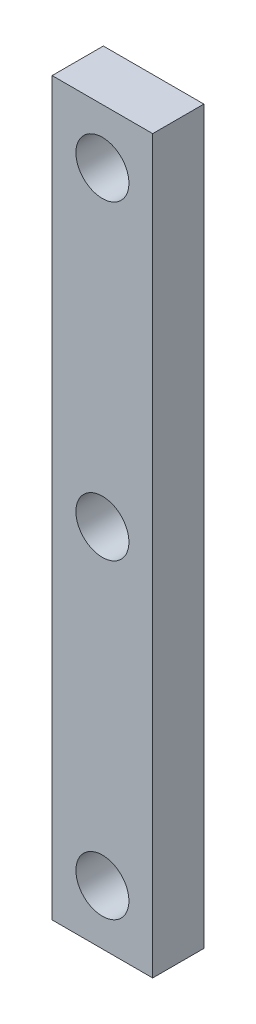
ISO-10303-21;
HEADER;
FILE_DESCRIPTION(('STEP AP214'),'2;1');
FILE_NAME('part.step','',(''),(''),'','','');
FILE_SCHEMA(('AUTOMOTIVE_DESIGN { 1 0 10303 214 1 1 1 1 }'));
ENDSEC;
DATA;
#1=APPLICATION_CONTEXT('core data for automotive mechanical design processes');
#2=APPLICATION_PROTOCOL_DEFINITION('international standard','automotive_design',2000,#1);
#3=PRODUCT_CONTEXT('',#1,'mechanical');
#4=PRODUCT('Part','Part','',(#3));
#5=PRODUCT_RELATED_PRODUCT_CATEGORY('part','',(#4));
#6=PRODUCT_DEFINITION_FORMATION('','',#4);
#7=PRODUCT_DEFINITION_CONTEXT('part definition',#1,'design');
#8=PRODUCT_DEFINITION('design','',#6,#7);
#9=PRODUCT_DEFINITION_SHAPE('','',#8);
#10=(LENGTH_UNIT() NAMED_UNIT(*) SI_UNIT(.MILLI.,.METRE.));
#11=(NAMED_UNIT(*) PLANE_ANGLE_UNIT() SI_UNIT($,.RADIAN.));
#12=(NAMED_UNIT(*) SI_UNIT($,.STERADIAN.) SOLID_ANGLE_UNIT());
#13=UNCERTAINTY_MEASURE_WITH_UNIT(LENGTH_MEASURE(1.E-05),#10,'distance_accuracy_value','');
#14=(GEOMETRIC_REPRESENTATION_CONTEXT(3) GLOBAL_UNCERTAINTY_ASSIGNED_CONTEXT((#13)) GLOBAL_UNIT_ASSIGNED_CONTEXT((#10,
#11,#12)) REPRESENTATION_CONTEXT('',''));
#15=CARTESIAN_POINT('',(0.,0.,0.));
#16=DIRECTION('',(0.,0.,1.));
#17=DIRECTION('',(1.,0.,0.));
#18=AXIS2_PLACEMENT_3D('',#15,#16,#17);
#19=CARTESIAN_POINT('',(-2.75,40.,1.4));
#20=DIRECTION('',(1.,0.,0.));
#21=DIRECTION('',(0.,0.,-1.));
#22=AXIS2_PLACEMENT_3D('',#19,#20,#21);
#23=PLANE('',#22);
#24=DIRECTION('',(0.,0.,1.));
#25=VECTOR('',#24,1.);
#26=CARTESIAN_POINT('',(-2.75,0.,1.4));
#27=LINE('',#26,#25);
#28=CARTESIAN_POINT('',(-2.75,0.,-1.4));
#29=VERTEX_POINT('',#28);
#30=CARTESIAN_POINT('',(-2.75,0.,1.4));
#31=VERTEX_POINT('',#30);
#32=EDGE_CURVE('E111',#29,#31,#27,.T.);
#33=ORIENTED_EDGE('',*,*,#32,.T.);
#34=DIRECTION('',(0.,-1.,0.));
#35=VECTOR('',#34,1.);
#36=CARTESIAN_POINT('',(-2.75,40.,1.4));
#37=LINE('',#36,#35);
#38=CARTESIAN_POINT('',(-2.75,40.,1.4));
#39=VERTEX_POINT('',#38);
#40=EDGE_CURVE('E11',#39,#31,#37,.T.);
#41=ORIENTED_EDGE('',*,*,#40,.F.);
#42=DIRECTION('',(0.,0.,1.));
#43=VECTOR('',#42,1.);
#44=CARTESIAN_POINT('',(-2.75,40.,1.4));
#45=LINE('',#44,#43);
#46=CARTESIAN_POINT('',(-2.75,40.,-1.4));
#47=VERTEX_POINT('',#46);
#48=EDGE_CURVE('E95',#47,#39,#45,.T.);
#49=ORIENTED_EDGE('',*,*,#48,.F.);
#50=DIRECTION('',(0.,-1.,0.));
#51=VECTOR('',#50,1.);
#52=CARTESIAN_POINT('',(-2.75,40.,-1.4));
#53=LINE('',#52,#51);
#54=EDGE_CURVE('E107',#47,#29,#53,.T.);
#55=ORIENTED_EDGE('',*,*,#54,.T.);
#56=EDGE_LOOP('',(#33,#41,#49,#55));
#57=FACE_BOUND('',#56,.T.);
#58=ADVANCED_FACE('F43',(#57),#23,.F.);
#59=CARTESIAN_POINT('',(-2.75,40.,1.4));
#60=DIRECTION('',(0.,0.,-1.));
#61=DIRECTION('',(-1.,0.,0.));
#62=AXIS2_PLACEMENT_3D('',#59,#60,#61);
#63=PLANE('',#62);
#64=CARTESIAN_POINT('',(0.,20.,1.4));
#65=DIRECTION('',(0.,0.,1.));
#66=DIRECTION('',(1.,0.,0.));
#67=AXIS2_PLACEMENT_3D('',#64,#65,#66);
#68=CIRCLE('',#67,1.45);
#69=CARTESIAN_POINT('',(1.45,20.,1.4));
#70=VERTEX_POINT('',#69);
#71=EDGE_CURVE('E151',#70,#70,#68,.T.);
#72=ORIENTED_EDGE('',*,*,#71,.F.);
#73=EDGE_LOOP('',(#72));
#74=FACE_BOUND('',#73,.T.);
#75=CARTESIAN_POINT('',(0.,37.,1.4));
#76=DIRECTION('',(0.,0.,1.));
#77=DIRECTION('',(1.,0.,0.));
#78=AXIS2_PLACEMENT_3D('',#75,#76,#77);
#79=CIRCLE('',#78,1.45);
#80=CARTESIAN_POINT('',(1.45,37.,1.4));
#81=VERTEX_POINT('',#80);
#82=EDGE_CURVE('E143',#81,#81,#79,.T.);
#83=ORIENTED_EDGE('',*,*,#82,.F.);
#84=EDGE_LOOP('',(#83));
#85=FACE_BOUND('',#84,.T.);
#86=CARTESIAN_POINT('',(0.,3.,1.4));
#87=DIRECTION('',(0.,0.,1.));
#88=DIRECTION('',(1.,0.,0.));
#89=AXIS2_PLACEMENT_3D('',#86,#87,#88);
#90=CIRCLE('',#89,1.45);
#91=CARTESIAN_POINT('',(1.45,3.,1.4));
#92=VERTEX_POINT('',#91);
#93=EDGE_CURVE('E135',#92,#92,#90,.T.);
#94=ORIENTED_EDGE('',*,*,#93,.F.);
#95=EDGE_LOOP('',(#94));
#96=FACE_BOUND('',#95,.T.);
#97=DIRECTION('',(1.,0.,0.));
#98=VECTOR('',#97,1.);
#99=CARTESIAN_POINT('',(-2.75,0.,1.4));
#100=LINE('',#99,#98);
#101=CARTESIAN_POINT('',(2.75,0.,1.4));
#102=VERTEX_POINT('',#101);
#103=EDGE_CURVE('E100',#31,#102,#100,.T.);
#104=ORIENTED_EDGE('',*,*,#103,.T.);
#105=DIRECTION('',(0.,-1.,0.));
#106=VECTOR('',#105,1.);
#107=CARTESIAN_POINT('',(2.75,40.,1.4));
#108=LINE('',#107,#106);
#109=CARTESIAN_POINT('',(2.75,40.,1.4));
#110=VERTEX_POINT('',#109);
#111=EDGE_CURVE('E52',#110,#102,#108,.T.);
#112=ORIENTED_EDGE('',*,*,#111,.F.);
#113=DIRECTION('',(1.,0.,0.));
#114=VECTOR('',#113,1.);
#115=CARTESIAN_POINT('',(-2.75,40.,1.4));
#116=LINE('',#115,#114);
#117=EDGE_CURVE('E90',#39,#110,#116,.T.);
#118=ORIENTED_EDGE('',*,*,#117,.F.);
#119=ORIENTED_EDGE('',*,*,#40,.T.);
#120=EDGE_LOOP('',(#104,#112,#118,#119));
#121=FACE_BOUND('',#120,.T.);
#122=ADVANCED_FACE('F99',(#74,#85,#96,#121),#63,.F.);
#123=CARTESIAN_POINT('',(2.75,40.,1.4));
#124=DIRECTION('',(-1.,0.,0.));
#125=DIRECTION('',(0.,0.,1.));
#126=AXIS2_PLACEMENT_3D('',#123,#124,#125);
#127=PLANE('',#126);
#128=DIRECTION('',(0.,0.,-1.));
#129=VECTOR('',#128,1.);
#130=CARTESIAN_POINT('',(2.75,0.,1.4));
#131=LINE('',#130,#129);
#132=CARTESIAN_POINT('',(2.75,0.,-1.4));
#133=VERTEX_POINT('',#132);
#134=EDGE_CURVE('E77',#102,#133,#131,.T.);
#135=ORIENTED_EDGE('',*,*,#134,.T.);
#136=DIRECTION('',(0.,-1.,0.));
#137=VECTOR('',#136,1.);
#138=CARTESIAN_POINT('',(2.75,40.,-1.4));
#139=LINE('',#138,#137);
#140=CARTESIAN_POINT('',(2.75,40.,-1.4));
#141=VERTEX_POINT('',#140);
#142=EDGE_CURVE('E102',#141,#133,#139,.T.);
#143=ORIENTED_EDGE('',*,*,#142,.F.);
#144=DIRECTION('',(0.,0.,-1.));
#145=VECTOR('',#144,1.);
#146=CARTESIAN_POINT('',(2.75,40.,1.4));
#147=LINE('',#146,#145);
#148=EDGE_CURVE('E93',#110,#141,#147,.T.);
#149=ORIENTED_EDGE('',*,*,#148,.F.);
#150=ORIENTED_EDGE('',*,*,#111,.T.);
#151=EDGE_LOOP('',(#135,#143,#149,#150));
#152=FACE_BOUND('',#151,.T.);
#153=ADVANCED_FACE('F103',(#152),#127,.F.);
#154=CARTESIAN_POINT('',(-2.75,40.,-1.4));
#155=DIRECTION('',(0.,0.,1.));
#156=DIRECTION('',(1.,0.,0.));
#157=AXIS2_PLACEMENT_3D('',#154,#155,#156);
#158=PLANE('',#157);
#159=CARTESIAN_POINT('',(0.,20.,-1.4));
#160=DIRECTION('',(0.,0.,1.));
#161=DIRECTION('',(1.,0.,0.));
#162=AXIS2_PLACEMENT_3D('',#159,#160,#161);
#163=CIRCLE('',#162,1.45);
#164=CARTESIAN_POINT('',(1.45,20.,-1.4));
#165=VERTEX_POINT('',#164);
#166=EDGE_CURVE('E147',#165,#165,#163,.T.);
#167=ORIENTED_EDGE('',*,*,#166,.T.);
#168=EDGE_LOOP('',(#167));
#169=FACE_BOUND('',#168,.T.);
#170=CARTESIAN_POINT('',(0.,37.,-1.4));
#171=DIRECTION('',(0.,0.,1.));
#172=DIRECTION('',(1.,0.,0.));
#173=AXIS2_PLACEMENT_3D('',#170,#171,#172);
#174=CIRCLE('',#173,1.45);
#175=CARTESIAN_POINT('',(1.45,37.,-1.4));
#176=VERTEX_POINT('',#175);
#177=EDGE_CURVE('E139',#176,#176,#174,.T.);
#178=ORIENTED_EDGE('',*,*,#177,.T.);
#179=EDGE_LOOP('',(#178));
#180=FACE_BOUND('',#179,.T.);
#181=CARTESIAN_POINT('',(0.,3.,-1.4));
#182=DIRECTION('',(0.,0.,1.));
#183=DIRECTION('',(1.,0.,0.));
#184=AXIS2_PLACEMENT_3D('',#181,#182,#183);
#185=CIRCLE('',#184,1.45);
#186=CARTESIAN_POINT('',(1.45,3.,-1.4));
#187=VERTEX_POINT('',#186);
#188=EDGE_CURVE('E115',#187,#187,#185,.T.);
#189=ORIENTED_EDGE('',*,*,#188,.T.);
#190=EDGE_LOOP('',(#189));
#191=FACE_BOUND('',#190,.T.);
#192=DIRECTION('',(-1.,0.,0.));
#193=VECTOR('',#192,1.);
#194=CARTESIAN_POINT('',(-2.75,0.,-1.4));
#195=LINE('',#194,#193);
#196=EDGE_CURVE('E83',#133,#29,#195,.T.);
#197=ORIENTED_EDGE('',*,*,#196,.T.);
#198=ORIENTED_EDGE('',*,*,#54,.F.);
#199=DIRECTION('',(-1.,0.,0.));
#200=VECTOR('',#199,1.);
#201=CARTESIAN_POINT('',(-2.75,40.,-1.4));
#202=LINE('',#201,#200);
#203=EDGE_CURVE('E60',#141,#47,#202,.T.);
#204=ORIENTED_EDGE('',*,*,#203,.F.);
#205=ORIENTED_EDGE('',*,*,#142,.T.);
#206=EDGE_LOOP('',(#197,#198,#204,#205));
#207=FACE_BOUND('',#206,.T.);
#208=ADVANCED_FACE('F125',(#169,#180,#191,#207),#158,.F.);
#209=CARTESIAN_POINT('',(0.,40.,0.));
#210=DIRECTION('',(0.,-1.,0.));
#211=DIRECTION('',(0.,0.,-1.));
#212=AXIS2_PLACEMENT_3D('',#209,#210,#211);
#213=PLANE('',#212);
#214=ORIENTED_EDGE('',*,*,#48,.T.);
#215=ORIENTED_EDGE('',*,*,#117,.T.);
#216=ORIENTED_EDGE('',*,*,#148,.T.);
#217=ORIENTED_EDGE('',*,*,#203,.T.);
#218=EDGE_LOOP('',(#214,#215,#216,#217));
#219=FACE_BOUND('',#218,.T.);
#220=ADVANCED_FACE('F91',(#219),#213,.F.);
#221=CARTESIAN_POINT('',(0.,0.,0.));
#222=DIRECTION('',(0.,-1.,0.));
#223=DIRECTION('',(0.,0.,-1.));
#224=AXIS2_PLACEMENT_3D('',#221,#222,#223);
#225=PLANE('',#224);
#226=ORIENTED_EDGE('',*,*,#32,.F.);
#227=ORIENTED_EDGE('',*,*,#196,.F.);
#228=ORIENTED_EDGE('',*,*,#134,.F.);
#229=ORIENTED_EDGE('',*,*,#103,.F.);
#230=EDGE_LOOP('',(#226,#227,#228,#229));
#231=FACE_BOUND('',#230,.T.);
#232=ADVANCED_FACE('F128',(#231),#225,.T.);
#233=CARTESIAN_POINT('',(0.,3.,1.4));
#234=DIRECTION('',(0.,0.,1.));
#235=DIRECTION('',(1.,0.,0.));
#236=AXIS2_PLACEMENT_3D('',#233,#234,#235);
#237=CYLINDRICAL_SURFACE('',#236,1.45);
#238=ORIENTED_EDGE('',*,*,#188,.F.);
#239=EDGE_LOOP('',(#238));
#240=FACE_BOUND('',#239,.T.);
#241=ORIENTED_EDGE('',*,*,#93,.T.);
#242=EDGE_LOOP('',(#241));
#243=FACE_BOUND('',#242,.T.);
#244=ADVANCED_FACE('F164',(#240,#243),#237,.F.);
#245=CARTESIAN_POINT('',(0.,37.,1.4));
#246=DIRECTION('',(0.,0.,1.));
#247=DIRECTION('',(1.,0.,0.));
#248=AXIS2_PLACEMENT_3D('',#245,#246,#247);
#249=CYLINDRICAL_SURFACE('',#248,1.45);
#250=ORIENTED_EDGE('',*,*,#177,.F.);
#251=EDGE_LOOP('',(#250));
#252=FACE_BOUND('',#251,.T.);
#253=ORIENTED_EDGE('',*,*,#82,.T.);
#254=EDGE_LOOP('',(#253));
#255=FACE_BOUND('',#254,.T.);
#256=ADVANCED_FACE('F166',(#252,#255),#249,.F.);
#257=CARTESIAN_POINT('',(0.,20.,1.4));
#258=DIRECTION('',(0.,0.,1.));
#259=DIRECTION('',(1.,0.,0.));
#260=AXIS2_PLACEMENT_3D('',#257,#258,#259);
#261=CYLINDRICAL_SURFACE('',#260,1.45);
#262=ORIENTED_EDGE('',*,*,#166,.F.);
#263=EDGE_LOOP('',(#262));
#264=FACE_BOUND('',#263,.T.);
#265=ORIENTED_EDGE('',*,*,#71,.T.);
#266=EDGE_LOOP('',(#265));
#267=FACE_BOUND('',#266,.T.);
#268=ADVANCED_FACE('F156',(#264,#267),#261,.F.);
#269=CLOSED_SHELL('',(#58,#122,#153,#208,#220,#232,#244,#256,#268));
#270=MANIFOLD_SOLID_BREP('B2',#269);
#271=ADVANCED_BREP_SHAPE_REPRESENTATION('',(#18,#270),#14);
#272=SHAPE_DEFINITION_REPRESENTATION(#9,#271);
ENDSEC;
END-ISO-10303-21;
